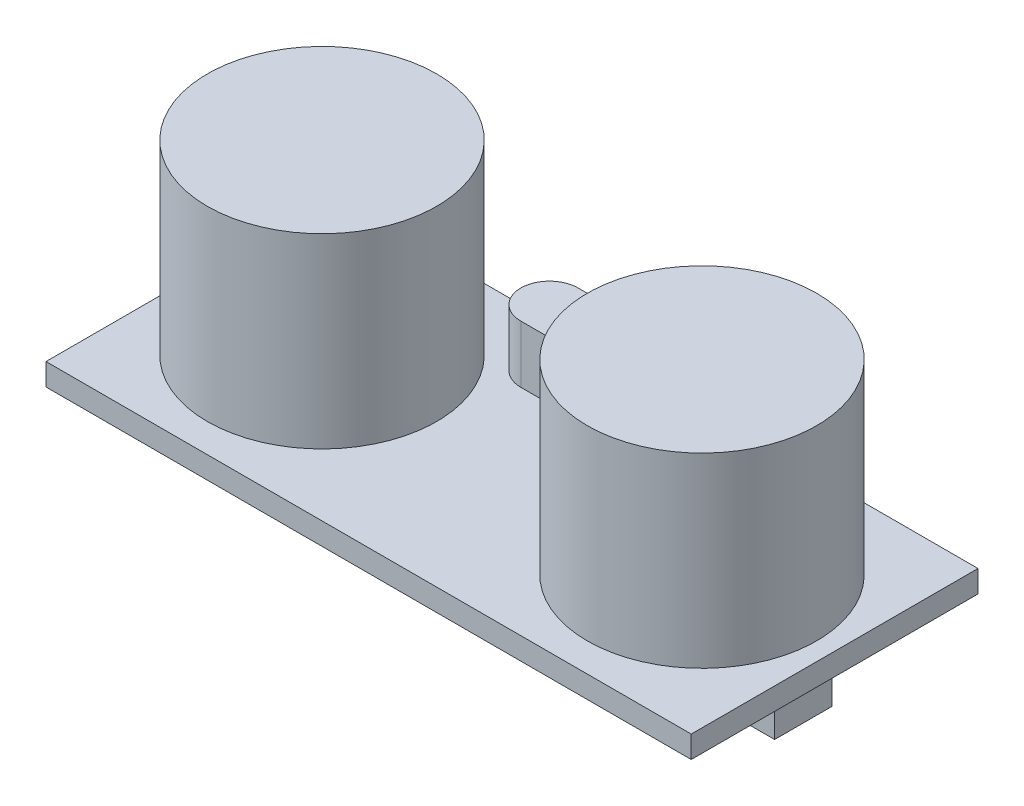
ISO-10303-21;
HEADER;
FILE_DESCRIPTION(('STEP AP214'),'2;1');
FILE_NAME('part.step','',(''),(''),'','','');
FILE_SCHEMA(('AUTOMOTIVE_DESIGN { 1 0 10303 214 1 1 1 1 }'));
ENDSEC;
DATA;
#1=APPLICATION_CONTEXT('core data for automotive mechanical design processes');
#2=APPLICATION_PROTOCOL_DEFINITION('international standard','automotive_design',2000,#1);
#3=PRODUCT_CONTEXT('',#1,'mechanical');
#4=PRODUCT('Part','Part','',(#3));
#5=PRODUCT_RELATED_PRODUCT_CATEGORY('part','',(#4));
#6=PRODUCT_DEFINITION_FORMATION('','',#4);
#7=PRODUCT_DEFINITION_CONTEXT('part definition',#1,'design');
#8=PRODUCT_DEFINITION('design','',#6,#7);
#9=PRODUCT_DEFINITION_SHAPE('','',#8);
#10=(LENGTH_UNIT() NAMED_UNIT(*) SI_UNIT(.MILLI.,.METRE.));
#11=(NAMED_UNIT(*) PLANE_ANGLE_UNIT() SI_UNIT($,.RADIAN.));
#12=(NAMED_UNIT(*) SI_UNIT($,.STERADIAN.) SOLID_ANGLE_UNIT());
#13=UNCERTAINTY_MEASURE_WITH_UNIT(LENGTH_MEASURE(1.E-05),#10,'distance_accuracy_value','');
#14=(GEOMETRIC_REPRESENTATION_CONTEXT(3) GLOBAL_UNCERTAINTY_ASSIGNED_CONTEXT((#13)) GLOBAL_UNIT_ASSIGNED_CONTEXT((#10,
#11,#12)) REPRESENTATION_CONTEXT('',''));
#15=CARTESIAN_POINT('',(0.,0.,0.));
#16=DIRECTION('',(0.,0.,1.));
#17=DIRECTION('',(1.,0.,0.));
#18=AXIS2_PLACEMENT_3D('',#15,#16,#17);
#19=CARTESIAN_POINT('',(0.,1.54,0.));
#20=DIRECTION('',(0.,-1.,0.));
#21=DIRECTION('',(0.,0.,-1.));
#22=AXIS2_PLACEMENT_3D('',#19,#20,#21);
#23=PLANE('',#22);
#24=CARTESIAN_POINT('',(13.25,1.54,0.));
#25=DIRECTION('',(0.,-1.,0.));
#26=DIRECTION('',(0.,0.,-1.));
#27=AXIS2_PLACEMENT_3D('',#24,#25,#26);
#28=CIRCLE('',#27,8.);
#29=CARTESIAN_POINT('',(13.25,1.54,-8.));
#30=VERTEX_POINT('',#29);
#31=EDGE_CURVE('E11',#30,#30,#28,.F.);
#32=ORIENTED_EDGE('',*,*,#31,.F.);
#33=EDGE_LOOP('',(#32));
#34=FACE_BOUND('',#33,.T.);
#35=DIRECTION('',(0.,0.,-1.));
#36=VECTOR('',#35,1.);
#37=CARTESIAN_POINT('',(22.5,1.54,10.));
#38=LINE('',#37,#36);
#39=CARTESIAN_POINT('',(22.5,1.54,10.));
#40=VERTEX_POINT('',#39);
#41=CARTESIAN_POINT('',(22.5,1.54,-10.));
#42=VERTEX_POINT('',#41);
#43=EDGE_CURVE('E311',#40,#42,#38,.T.);
#44=ORIENTED_EDGE('',*,*,#43,.T.);
#45=DIRECTION('',(-1.,0.,0.));
#46=VECTOR('',#45,1.);
#47=CARTESIAN_POINT('',(-22.5,1.54,-10.));
#48=LINE('',#47,#46);
#49=CARTESIAN_POINT('',(-22.5,1.54,-10.));
#50=VERTEX_POINT('',#49);
#51=EDGE_CURVE('E314',#42,#50,#48,.T.);
#52=ORIENTED_EDGE('',*,*,#51,.T.);
#53=DIRECTION('',(0.,0.,1.));
#54=VECTOR('',#53,1.);
#55=CARTESIAN_POINT('',(-22.5,1.54,10.));
#56=LINE('',#55,#54);
#57=CARTESIAN_POINT('',(-22.5,1.54,10.));
#58=VERTEX_POINT('',#57);
#59=EDGE_CURVE('E317',#50,#58,#56,.T.);
#60=ORIENTED_EDGE('',*,*,#59,.T.);
#61=DIRECTION('',(1.,0.,0.));
#62=VECTOR('',#61,1.);
#63=CARTESIAN_POINT('',(-22.5,1.54,10.));
#64=LINE('',#63,#62);
#65=EDGE_CURVE('E319',#58,#40,#64,.T.);
#66=ORIENTED_EDGE('',*,*,#65,.T.);
#67=EDGE_LOOP('',(#44,#52,#60,#66));
#68=FACE_BOUND('',#67,.T.);
#69=CARTESIAN_POINT('',(-13.25,1.54,0.));
#70=DIRECTION('',(0.,-1.,0.));
#71=DIRECTION('',(0.,0.,-1.));
#72=AXIS2_PLACEMENT_3D('',#69,#70,#71);
#73=CIRCLE('',#72,8.);
#74=CARTESIAN_POINT('',(-13.25,1.54,-8.));
#75=VERTEX_POINT('',#74);
#76=EDGE_CURVE('E41',#75,#75,#73,.F.);
#77=ORIENTED_EDGE('',*,*,#76,.F.);
#78=EDGE_LOOP('',(#77));
#79=FACE_BOUND('',#78,.T.);
#80=CARTESIAN_POINT('',(-4.38645159996524,1.54,-7.));
#81=DIRECTION('',(0.,1.,0.));
#82=DIRECTION('',(0.,0.,1.));
#83=AXIS2_PLACEMENT_3D('',#80,#81,#82);
#84=CIRCLE('',#83,2.);
#85=CARTESIAN_POINT('',(-4.38645159996524,1.54,-9.));
#86=VERTEX_POINT('',#85);
#87=CARTESIAN_POINT('',(-4.38645159996524,1.54,-5.));
#88=VERTEX_POINT('',#87);
#89=EDGE_CURVE('E263',#86,#88,#84,.T.);
#90=ORIENTED_EDGE('',*,*,#89,.F.);
#91=DIRECTION('',(-1.,0.,0.));
#92=VECTOR('',#91,1.);
#93=CARTESIAN_POINT('',(-4.38645159996524,1.54,-9.));
#94=LINE('',#93,#92);
#95=CARTESIAN_POINT('',(4.38645159996524,1.54,-9.00000000000001));
#96=VERTEX_POINT('',#95);
#97=EDGE_CURVE('E276',#96,#86,#94,.T.);
#98=ORIENTED_EDGE('',*,*,#97,.F.);
#99=CARTESIAN_POINT('',(4.38645159996524,1.54,-7.));
#100=DIRECTION('',(0.,1.,0.));
#101=DIRECTION('',(0.,0.,1.));
#102=AXIS2_PLACEMENT_3D('',#99,#100,#101);
#103=CIRCLE('',#102,2.);
#104=CARTESIAN_POINT('',(4.38645159996524,1.54,-5.));
#105=VERTEX_POINT('',#104);
#106=EDGE_CURVE('E288',#105,#96,#103,.T.);
#107=ORIENTED_EDGE('',*,*,#106,.F.);
#108=DIRECTION('',(1.,0.,0.));
#109=VECTOR('',#108,1.);
#110=CARTESIAN_POINT('',(-4.38645159996524,1.54,-5.));
#111=LINE('',#110,#109);
#112=EDGE_CURVE('E285',#88,#105,#111,.T.);
#113=ORIENTED_EDGE('',*,*,#112,.F.);
#114=EDGE_LOOP('',(#90,#98,#107,#113));
#115=FACE_BOUND('',#114,.T.);
#116=ADVANCED_FACE('F33',(#34,#68,#79,#115),#23,.F.);
#117=CARTESIAN_POINT('',(22.5,1.54,10.));
#118=DIRECTION('',(-1.,0.,0.));
#119=DIRECTION('',(0.,0.,1.));
#120=AXIS2_PLACEMENT_3D('',#117,#118,#119);
#121=PLANE('',#120);
#122=DIRECTION('',(0.,0.,-1.));
#123=VECTOR('',#122,1.);
#124=CARTESIAN_POINT('',(22.5,0.,10.));
#125=LINE('',#124,#123);
#126=CARTESIAN_POINT('',(22.5,0.,10.));
#127=VERTEX_POINT('',#126);
#128=CARTESIAN_POINT('',(22.5,0.,-10.));
#129=VERTEX_POINT('',#128);
#130=EDGE_CURVE('E310',#127,#129,#125,.T.);
#131=ORIENTED_EDGE('',*,*,#130,.T.);
#132=DIRECTION('',(0.,-1.,0.));
#133=VECTOR('',#132,1.);
#134=CARTESIAN_POINT('',(22.5,1.54,-10.));
#135=LINE('',#134,#133);
#136=EDGE_CURVE('E337',#42,#129,#135,.T.);
#137=ORIENTED_EDGE('',*,*,#136,.F.);
#138=ORIENTED_EDGE('',*,*,#43,.F.);
#139=DIRECTION('',(0.,-1.,0.));
#140=VECTOR('',#139,1.);
#141=CARTESIAN_POINT('',(22.5,1.54,10.));
#142=LINE('',#141,#140);
#143=EDGE_CURVE('E321',#40,#127,#142,.T.);
#144=ORIENTED_EDGE('',*,*,#143,.T.);
#145=EDGE_LOOP('',(#131,#137,#138,#144));
#146=FACE_BOUND('',#145,.T.);
#147=ADVANCED_FACE('F35',(#146),#121,.F.);
#148=CARTESIAN_POINT('',(-22.5,1.54,-10.));
#149=DIRECTION('',(0.,0.,1.));
#150=DIRECTION('',(1.,0.,0.));
#151=AXIS2_PLACEMENT_3D('',#148,#149,#150);
#152=PLANE('',#151);
#153=DIRECTION('',(-1.,0.,0.));
#154=VECTOR('',#153,1.);
#155=CARTESIAN_POINT('',(-22.5,0.,-10.));
#156=LINE('',#155,#154);
#157=CARTESIAN_POINT('',(-22.5,0.,-10.));
#158=VERTEX_POINT('',#157);
#159=EDGE_CURVE('E324',#129,#158,#156,.T.);
#160=ORIENTED_EDGE('',*,*,#159,.T.);
#161=DIRECTION('',(0.,-1.,0.));
#162=VECTOR('',#161,1.);
#163=CARTESIAN_POINT('',(-22.5,1.54,-10.));
#164=LINE('',#163,#162);
#165=EDGE_CURVE('E334',#50,#158,#164,.T.);
#166=ORIENTED_EDGE('',*,*,#165,.F.);
#167=ORIENTED_EDGE('',*,*,#51,.F.);
#168=ORIENTED_EDGE('',*,*,#136,.T.);
#169=EDGE_LOOP('',(#160,#166,#167,#168));
#170=FACE_BOUND('',#169,.T.);
#171=ADVANCED_FACE('F399',(#170),#152,.F.);
#172=CARTESIAN_POINT('',(-22.5,1.54,10.));
#173=DIRECTION('',(1.,0.,0.));
#174=DIRECTION('',(0.,0.,-1.));
#175=AXIS2_PLACEMENT_3D('',#172,#173,#174);
#176=PLANE('',#175);
#177=DIRECTION('',(0.,0.,1.));
#178=VECTOR('',#177,1.);
#179=CARTESIAN_POINT('',(-22.5,0.,10.));
#180=LINE('',#179,#178);
#181=CARTESIAN_POINT('',(-22.5,0.,10.));
#182=VERTEX_POINT('',#181);
#183=EDGE_CURVE('E326',#158,#182,#180,.T.);
#184=ORIENTED_EDGE('',*,*,#183,.T.);
#185=DIRECTION('',(0.,-1.,0.));
#186=VECTOR('',#185,1.);
#187=CARTESIAN_POINT('',(-22.5,1.54,10.));
#188=LINE('',#187,#186);
#189=EDGE_CURVE('E331',#58,#182,#188,.T.);
#190=ORIENTED_EDGE('',*,*,#189,.F.);
#191=ORIENTED_EDGE('',*,*,#59,.F.);
#192=ORIENTED_EDGE('',*,*,#165,.T.);
#193=EDGE_LOOP('',(#184,#190,#191,#192));
#194=FACE_BOUND('',#193,.T.);
#195=ADVANCED_FACE('F396',(#194),#176,.F.);
#196=CARTESIAN_POINT('',(-22.5,1.54,10.));
#197=DIRECTION('',(0.,0.,-1.));
#198=DIRECTION('',(-1.,0.,0.));
#199=AXIS2_PLACEMENT_3D('',#196,#197,#198);
#200=PLANE('',#199);
#201=DIRECTION('',(1.,0.,0.));
#202=VECTOR('',#201,1.);
#203=CARTESIAN_POINT('',(-22.5,0.,10.));
#204=LINE('',#203,#202);
#205=EDGE_CURVE('E315',#182,#127,#204,.T.);
#206=ORIENTED_EDGE('',*,*,#205,.T.);
#207=ORIENTED_EDGE('',*,*,#143,.F.);
#208=ORIENTED_EDGE('',*,*,#65,.F.);
#209=ORIENTED_EDGE('',*,*,#189,.T.);
#210=EDGE_LOOP('',(#206,#207,#208,#209));
#211=FACE_BOUND('',#210,.T.);
#212=ADVANCED_FACE('F393',(#211),#200,.F.);
#213=CARTESIAN_POINT('',(0.,0.,0.));
#214=DIRECTION('',(0.,-1.,0.));
#215=DIRECTION('',(0.,0.,-1.));
#216=AXIS2_PLACEMENT_3D('',#213,#214,#215);
#217=PLANE('',#216);
#218=DIRECTION('',(0.,0.,-1.));
#219=VECTOR('',#218,1.);
#220=CARTESIAN_POINT('',(-15.9,0.,6.));
#221=LINE('',#220,#219);
#222=CARTESIAN_POINT('',(-15.9,0.,6.));
#223=VERTEX_POINT('',#222);
#224=CARTESIAN_POINT('',(-15.9,0.,-2.9));
#225=VERTEX_POINT('',#224);
#226=EDGE_CURVE('E199',#223,#225,#221,.T.);
#227=ORIENTED_EDGE('',*,*,#226,.T.);
#228=DIRECTION('',(-1.,0.,0.));
#229=VECTOR('',#228,1.);
#230=CARTESIAN_POINT('',(-19.9,0.,-2.9));
#231=LINE('',#230,#229);
#232=CARTESIAN_POINT('',(-19.9,0.,-2.9));
#233=VERTEX_POINT('',#232);
#234=EDGE_CURVE('E175',#225,#233,#231,.T.);
#235=ORIENTED_EDGE('',*,*,#234,.T.);
#236=DIRECTION('',(0.,0.,1.));
#237=VECTOR('',#236,1.);
#238=CARTESIAN_POINT('',(-19.9,0.,6.));
#239=LINE('',#238,#237);
#240=CARTESIAN_POINT('',(-19.9,0.,6.));
#241=VERTEX_POINT('',#240);
#242=EDGE_CURVE('E53',#233,#241,#239,.T.);
#243=ORIENTED_EDGE('',*,*,#242,.T.);
#244=DIRECTION('',(1.,0.,0.));
#245=VECTOR('',#244,1.);
#246=CARTESIAN_POINT('',(-19.9,0.,6.));
#247=LINE('',#246,#245);
#248=EDGE_CURVE('E48',#241,#223,#247,.T.);
#249=ORIENTED_EDGE('',*,*,#248,.T.);
#250=EDGE_LOOP('',(#227,#235,#243,#249));
#251=FACE_BOUND('',#250,.T.);
#252=DIRECTION('',(0.,0.,-1.));
#253=VECTOR('',#252,1.);
#254=CARTESIAN_POINT('',(20.7,0.,-1.61583617625605));
#255=LINE('',#254,#253);
#256=CARTESIAN_POINT('',(20.7,0.,2.38416382374395));
#257=VERTEX_POINT('',#256);
#258=CARTESIAN_POINT('',(20.7,0.,-1.61583617625605));
#259=VERTEX_POINT('',#258);
#260=EDGE_CURVE('E204',#257,#259,#255,.T.);
#261=ORIENTED_EDGE('',*,*,#260,.T.);
#262=DIRECTION('',(-1.,0.,0.));
#263=VECTOR('',#262,1.);
#264=CARTESIAN_POINT('',(11.8,0.,-1.61583617625605));
#265=LINE('',#264,#263);
#266=CARTESIAN_POINT('',(11.8,0.,-1.61583617625605));
#267=VERTEX_POINT('',#266);
#268=EDGE_CURVE('E223',#259,#267,#265,.T.);
#269=ORIENTED_EDGE('',*,*,#268,.T.);
#270=DIRECTION('',(0.,0.,1.));
#271=VECTOR('',#270,1.);
#272=CARTESIAN_POINT('',(11.8,0.,-1.61583617625605));
#273=LINE('',#272,#271);
#274=CARTESIAN_POINT('',(11.8,0.,2.38416382374395));
#275=VERTEX_POINT('',#274);
#276=EDGE_CURVE('E225',#267,#275,#273,.T.);
#277=ORIENTED_EDGE('',*,*,#276,.T.);
#278=DIRECTION('',(1.,0.,0.));
#279=VECTOR('',#278,1.);
#280=CARTESIAN_POINT('',(11.8,0.,2.38416382374395));
#281=LINE('',#280,#279);
#282=EDGE_CURVE('E212',#275,#257,#281,.T.);
#283=ORIENTED_EDGE('',*,*,#282,.T.);
#284=EDGE_LOOP('',(#261,#269,#277,#283));
#285=FACE_BOUND('',#284,.T.);
#286=DIRECTION('',(0.,0.,-1.));
#287=VECTOR('',#286,1.);
#288=CARTESIAN_POINT('',(4.45,0.,-2.));
#289=LINE('',#288,#287);
#290=CARTESIAN_POINT('',(4.45,0.,2.));
#291=VERTEX_POINT('',#290);
#292=CARTESIAN_POINT('',(4.45,0.,-2.));
#293=VERTEX_POINT('',#292);
#294=EDGE_CURVE('E231',#291,#293,#289,.T.);
#295=ORIENTED_EDGE('',*,*,#294,.T.);
#296=DIRECTION('',(-1.,0.,0.));
#297=VECTOR('',#296,1.);
#298=CARTESIAN_POINT('',(-4.45,0.,-2.));
#299=LINE('',#298,#297);
#300=CARTESIAN_POINT('',(-4.45,0.,-2.));
#301=VERTEX_POINT('',#300);
#302=EDGE_CURVE('E255',#293,#301,#299,.T.);
#303=ORIENTED_EDGE('',*,*,#302,.T.);
#304=DIRECTION('',(0.,0.,1.));
#305=VECTOR('',#304,1.);
#306=CARTESIAN_POINT('',(-4.45,0.,-2.));
#307=LINE('',#306,#305);
#308=CARTESIAN_POINT('',(-4.45,0.,2.));
#309=VERTEX_POINT('',#308);
#310=EDGE_CURVE('E257',#301,#309,#307,.T.);
#311=ORIENTED_EDGE('',*,*,#310,.T.);
#312=DIRECTION('',(1.,0.,0.));
#313=VECTOR('',#312,1.);
#314=CARTESIAN_POINT('',(-4.45,0.,2.));
#315=LINE('',#314,#313);
#316=EDGE_CURVE('E244',#309,#291,#315,.T.);
#317=ORIENTED_EDGE('',*,*,#316,.T.);
#318=EDGE_LOOP('',(#295,#303,#311,#317));
#319=FACE_BOUND('',#318,.T.);
#320=ORIENTED_EDGE('',*,*,#130,.F.);
#321=ORIENTED_EDGE('',*,*,#205,.F.);
#322=ORIENTED_EDGE('',*,*,#183,.F.);
#323=ORIENTED_EDGE('',*,*,#159,.F.);
#324=EDGE_LOOP('',(#320,#321,#322,#323));
#325=FACE_BOUND('',#324,.T.);
#326=ADVANCED_FACE('F388',(#251,#285,#319,#325),#217,.T.);
#327=CARTESIAN_POINT('',(-13.25,14.54,0.));
#328=DIRECTION('',(0.,-1.,0.));
#329=DIRECTION('',(0.,0.,-1.));
#330=AXIS2_PLACEMENT_3D('',#327,#328,#329);
#331=CYLINDRICAL_SURFACE('',#330,8.);
#332=CARTESIAN_POINT('',(-13.25,14.54,0.));
#333=DIRECTION('',(0.,1.,0.));
#334=DIRECTION('',(0.,0.,1.));
#335=AXIS2_PLACEMENT_3D('',#332,#333,#334);
#336=CIRCLE('',#335,8.);
#337=CARTESIAN_POINT('',(-13.25,14.54,-8.));
#338=VERTEX_POINT('',#337);
#339=EDGE_CURVE('E307',#338,#338,#336,.T.);
#340=CARTESIAN_POINT('',(-13.25,14.54,-8.));
#341=CARTESIAN_POINT('',(-13.25,14.4045833333333,-8.));
#342=CARTESIAN_POINT('',(-13.25,14.2691666666667,-8.));
#343=CARTESIAN_POINT('',(-13.25,13.9983333333333,-8.));
#344=CARTESIAN_POINT('',(-13.25,13.8629166666667,-8.));
#345=CARTESIAN_POINT('',(-13.25,13.5920833333333,-8.));
#346=CARTESIAN_POINT('',(-13.25,13.4566666666667,-8.));
#347=CARTESIAN_POINT('',(-13.25,13.1858333333333,-8.));
#348=CARTESIAN_POINT('',(-13.25,13.0504166666667,-8.));
#349=CARTESIAN_POINT('',(-13.25,12.7795833333333,-8.));
#350=CARTESIAN_POINT('',(-13.25,12.6441666666667,-8.));
#351=CARTESIAN_POINT('',(-13.25,12.3733333333333,-8.));
#352=CARTESIAN_POINT('',(-13.25,12.2379166666667,-8.));
#353=CARTESIAN_POINT('',(-13.25,11.9670833333333,-8.));
#354=CARTESIAN_POINT('',(-13.25,11.8316666666667,-8.));
#355=CARTESIAN_POINT('',(-13.25,11.5608333333333,-8.));
#356=CARTESIAN_POINT('',(-13.25,11.4254166666667,-8.));
#357=CARTESIAN_POINT('',(-13.25,11.1545833333333,-8.));
#358=CARTESIAN_POINT('',(-13.25,11.0191666666667,-8.));
#359=CARTESIAN_POINT('',(-13.25,10.7483333333333,-8.));
#360=CARTESIAN_POINT('',(-13.25,10.6129166666667,-8.));
#361=CARTESIAN_POINT('',(-13.25,10.3420833333333,-8.));
#362=CARTESIAN_POINT('',(-13.25,10.2066666666667,-8.));
#363=CARTESIAN_POINT('',(-13.25,9.93583333333333,-8.));
#364=CARTESIAN_POINT('',(-13.25,9.80041666666667,-8.));
#365=CARTESIAN_POINT('',(-13.25,9.52958333333333,-8.));
#366=CARTESIAN_POINT('',(-13.25,9.39416666666667,-8.));
#367=CARTESIAN_POINT('',(-13.25,9.12333333333333,-8.));
#368=CARTESIAN_POINT('',(-13.25,8.98791666666667,-8.));
#369=CARTESIAN_POINT('',(-13.25,8.71708333333333,-8.));
#370=CARTESIAN_POINT('',(-13.25,8.58166666666667,-8.));
#371=CARTESIAN_POINT('',(-13.25,8.31083333333333,-8.));
#372=CARTESIAN_POINT('',(-13.25,8.17541666666667,-8.));
#373=CARTESIAN_POINT('',(-13.25,7.90458333333333,-8.));
#374=CARTESIAN_POINT('',(-13.25,7.76916666666666,-8.));
#375=CARTESIAN_POINT('',(-13.25,7.49833333333333,-8.));
#376=CARTESIAN_POINT('',(-13.25,7.36291666666667,-8.));
#377=CARTESIAN_POINT('',(-13.25,7.09208333333333,-8.));
#378=CARTESIAN_POINT('',(-13.25,6.95666666666667,-8.));
#379=CARTESIAN_POINT('',(-13.25,6.68583333333333,-8.));
#380=CARTESIAN_POINT('',(-13.25,6.55041666666667,-8.));
#381=CARTESIAN_POINT('',(-13.25,6.27958333333333,-8.));
#382=CARTESIAN_POINT('',(-13.25,6.14416666666667,-8.));
#383=CARTESIAN_POINT('',(-13.25,5.87333333333333,-8.));
#384=CARTESIAN_POINT('',(-13.25,5.73791666666667,-8.));
#385=CARTESIAN_POINT('',(-13.25,5.46708333333333,-8.));
#386=CARTESIAN_POINT('',(-13.25,5.33166666666667,-8.));
#387=CARTESIAN_POINT('',(-13.25,5.06083333333333,-8.));
#388=CARTESIAN_POINT('',(-13.25,4.92541666666667,-8.));
#389=CARTESIAN_POINT('',(-13.25,4.65458333333333,-8.));
#390=CARTESIAN_POINT('',(-13.25,4.51916666666667,-8.));
#391=CARTESIAN_POINT('',(-13.25,4.24833333333333,-8.));
#392=CARTESIAN_POINT('',(-13.25,4.11291666666667,-8.));
#393=CARTESIAN_POINT('',(-13.25,3.84208333333333,-8.));
#394=CARTESIAN_POINT('',(-13.25,3.70666666666667,-8.));
#395=CARTESIAN_POINT('',(-13.25,3.43583333333333,-8.));
#396=CARTESIAN_POINT('',(-13.25,3.30041666666667,-8.));
#397=CARTESIAN_POINT('',(-13.25,3.02958333333333,-8.));
#398=CARTESIAN_POINT('',(-13.25,2.89416666666667,-8.));
#399=CARTESIAN_POINT('',(-13.25,2.62333333333333,-8.));
#400=CARTESIAN_POINT('',(-13.25,2.48791666666667,-8.));
#401=CARTESIAN_POINT('',(-13.25,2.21708333333333,-8.));
#402=CARTESIAN_POINT('',(-13.25,2.08166666666667,-8.));
#403=CARTESIAN_POINT('',(-13.25,1.81083333333333,-8.));
#404=CARTESIAN_POINT('',(-13.25,1.67541666666667,-8.));
#405=CARTESIAN_POINT('',(-13.25,1.54,-8.));
#406=B_SPLINE_CURVE_WITH_KNOTS('',3,(#340,#341,#342,#343,#344,#345,#346,#347,#348,#349,#350,
#351,#352,#353,#354,#355,#356,#357,#358,#359,#360,#361,#362,#363,#364,#365,#366,#367,#368,#369,
#370,#371,#372,#373,#374,#375,#376,#377,#378,#379,#380,#381,#382,#383,#384,#385,#386,#387,#388,
#389,#390,#391,#392,#393,#394,#395,#396,#397,#398,#399,#400,#401,#402,#403,#404,#405),
.UNSPECIFIED.,.F.,.F.,(4,2,2,2,2,2,2,2,2,2,2,2,2,2,2,2,2,2,2,2,2,2,2,2,2,2,2,2,2,2,2,2,4),(0.,
0.40625,0.812500000000001,1.21875,1.625,2.03125,2.4375,2.84375,3.25,3.65625,4.0625,4.46875,
4.875,5.28125,5.6875,6.09375,6.5,6.90625,7.3125,7.71875,8.125,8.53125,8.9375,9.34375,9.75,
10.15625,10.5625,10.96875,11.375,11.78125,12.1875,12.59375,13.),.UNSPECIFIED.);
#407=EDGE_CURVE('BSEAM342',#338,#75,#406,.T.);
#408=ORIENTED_EDGE('',*,*,#339,.F.);
#409=ORIENTED_EDGE('',*,*,#76,.T.);
#410=ORIENTED_EDGE('',*,*,#407,.T.);
#411=ORIENTED_EDGE('',*,*,#407,.F.);
#412=EDGE_LOOP('',(#408,#410,#409,#411));
#413=FACE_BOUND('',#412,.T.);
#414=ADVANCED_FACE('F342',(#413),#331,.T.);
#415=CARTESIAN_POINT('',(-13.25,14.54,0.));
#416=DIRECTION('',(0.,1.,0.));
#417=DIRECTION('',(0.,0.,1.));
#418=AXIS2_PLACEMENT_3D('',#415,#416,#417);
#419=PLANE('',#418);
#420=ORIENTED_EDGE('',*,*,#339,.T.);
#421=EDGE_LOOP('',(#420));
#422=FACE_BOUND('',#421,.T.);
#423=ADVANCED_FACE('F382',(#422),#419,.T.);
#424=CARTESIAN_POINT('',(13.25,14.54,0.));
#425=DIRECTION('',(0.,-1.,0.));
#426=DIRECTION('',(0.,0.,-1.));
#427=AXIS2_PLACEMENT_3D('',#424,#425,#426);
#428=CYLINDRICAL_SURFACE('',#427,8.);
#429=CARTESIAN_POINT('',(13.25,14.54,0.));
#430=DIRECTION('',(0.,1.,0.));
#431=DIRECTION('',(0.,0.,1.));
#432=AXIS2_PLACEMENT_3D('',#429,#430,#431);
#433=CIRCLE('',#432,8.);
#434=CARTESIAN_POINT('',(13.25,14.54,-8.));
#435=VERTEX_POINT('',#434);
#436=EDGE_CURVE('E304',#435,#435,#433,.T.);
#437=CARTESIAN_POINT('',(13.25,14.54,-8.));
#438=CARTESIAN_POINT('',(13.25,14.4045833333333,-8.));
#439=CARTESIAN_POINT('',(13.25,14.2691666666667,-8.));
#440=CARTESIAN_POINT('',(13.25,13.9983333333333,-8.));
#441=CARTESIAN_POINT('',(13.25,13.8629166666667,-8.));
#442=CARTESIAN_POINT('',(13.25,13.5920833333333,-8.));
#443=CARTESIAN_POINT('',(13.25,13.4566666666667,-8.));
#444=CARTESIAN_POINT('',(13.25,13.1858333333333,-8.));
#445=CARTESIAN_POINT('',(13.25,13.0504166666667,-8.));
#446=CARTESIAN_POINT('',(13.25,12.7795833333333,-8.));
#447=CARTESIAN_POINT('',(13.25,12.6441666666667,-8.));
#448=CARTESIAN_POINT('',(13.25,12.3733333333333,-8.));
#449=CARTESIAN_POINT('',(13.25,12.2379166666667,-8.));
#450=CARTESIAN_POINT('',(13.25,11.9670833333333,-8.));
#451=CARTESIAN_POINT('',(13.25,11.8316666666667,-8.));
#452=CARTESIAN_POINT('',(13.25,11.5608333333333,-8.));
#453=CARTESIAN_POINT('',(13.25,11.4254166666667,-8.));
#454=CARTESIAN_POINT('',(13.25,11.1545833333333,-8.));
#455=CARTESIAN_POINT('',(13.25,11.0191666666667,-8.));
#456=CARTESIAN_POINT('',(13.25,10.7483333333333,-8.));
#457=CARTESIAN_POINT('',(13.25,10.6129166666667,-8.));
#458=CARTESIAN_POINT('',(13.25,10.3420833333333,-8.));
#459=CARTESIAN_POINT('',(13.25,10.2066666666667,-8.));
#460=CARTESIAN_POINT('',(13.25,9.93583333333333,-8.));
#461=CARTESIAN_POINT('',(13.25,9.80041666666667,-8.));
#462=CARTESIAN_POINT('',(13.25,9.52958333333333,-8.));
#463=CARTESIAN_POINT('',(13.25,9.39416666666667,-8.));
#464=CARTESIAN_POINT('',(13.25,9.12333333333333,-8.));
#465=CARTESIAN_POINT('',(13.25,8.98791666666667,-8.));
#466=CARTESIAN_POINT('',(13.25,8.71708333333333,-8.));
#467=CARTESIAN_POINT('',(13.25,8.58166666666667,-8.));
#468=CARTESIAN_POINT('',(13.25,8.31083333333333,-8.));
#469=CARTESIAN_POINT('',(13.25,8.17541666666667,-8.));
#470=CARTESIAN_POINT('',(13.25,7.90458333333333,-8.));
#471=CARTESIAN_POINT('',(13.25,7.76916666666666,-8.));
#472=CARTESIAN_POINT('',(13.25,7.49833333333333,-8.));
#473=CARTESIAN_POINT('',(13.25,7.36291666666667,-8.));
#474=CARTESIAN_POINT('',(13.25,7.09208333333333,-8.));
#475=CARTESIAN_POINT('',(13.25,6.95666666666667,-8.));
#476=CARTESIAN_POINT('',(13.25,6.68583333333333,-8.));
#477=CARTESIAN_POINT('',(13.25,6.55041666666667,-8.));
#478=CARTESIAN_POINT('',(13.25,6.27958333333333,-8.));
#479=CARTESIAN_POINT('',(13.25,6.14416666666667,-8.));
#480=CARTESIAN_POINT('',(13.25,5.87333333333333,-8.));
#481=CARTESIAN_POINT('',(13.25,5.73791666666667,-8.));
#482=CARTESIAN_POINT('',(13.25,5.46708333333333,-8.));
#483=CARTESIAN_POINT('',(13.25,5.33166666666667,-8.));
#484=CARTESIAN_POINT('',(13.25,5.06083333333333,-8.));
#485=CARTESIAN_POINT('',(13.25,4.92541666666667,-8.));
#486=CARTESIAN_POINT('',(13.25,4.65458333333333,-8.));
#487=CARTESIAN_POINT('',(13.25,4.51916666666667,-8.));
#488=CARTESIAN_POINT('',(13.25,4.24833333333333,-8.));
#489=CARTESIAN_POINT('',(13.25,4.11291666666667,-8.));
#490=CARTESIAN_POINT('',(13.25,3.84208333333333,-8.));
#491=CARTESIAN_POINT('',(13.25,3.70666666666667,-8.));
#492=CARTESIAN_POINT('',(13.25,3.43583333333333,-8.));
#493=CARTESIAN_POINT('',(13.25,3.30041666666667,-8.));
#494=CARTESIAN_POINT('',(13.25,3.02958333333333,-8.));
#495=CARTESIAN_POINT('',(13.25,2.89416666666667,-8.));
#496=CARTESIAN_POINT('',(13.25,2.62333333333333,-8.));
#497=CARTESIAN_POINT('',(13.25,2.48791666666667,-8.));
#498=CARTESIAN_POINT('',(13.25,2.21708333333333,-8.));
#499=CARTESIAN_POINT('',(13.25,2.08166666666667,-8.));
#500=CARTESIAN_POINT('',(13.25,1.81083333333333,-8.));
#501=CARTESIAN_POINT('',(13.25,1.67541666666667,-8.));
#502=CARTESIAN_POINT('',(13.25,1.54,-8.));
#503=B_SPLINE_CURVE_WITH_KNOTS('',3,(#437,#438,#439,#440,#441,#442,#443,#444,#445,#446,#447,
#448,#449,#450,#451,#452,#453,#454,#455,#456,#457,#458,#459,#460,#461,#462,#463,#464,#465,#466,
#467,#468,#469,#470,#471,#472,#473,#474,#475,#476,#477,#478,#479,#480,#481,#482,#483,#484,#485,
#486,#487,#488,#489,#490,#491,#492,#493,#494,#495,#496,#497,#498,#499,#500,#501,#502),
.UNSPECIFIED.,.F.,.F.,(4,2,2,2,2,2,2,2,2,2,2,2,2,2,2,2,2,2,2,2,2,2,2,2,2,2,2,2,2,2,2,2,4),(0.,
0.40625,0.812500000000001,1.21875,1.625,2.03125,2.4375,2.84375,3.25,3.65625,4.0625,4.46875,
4.875,5.28125,5.6875,6.09375,6.5,6.90625,7.3125,7.71875,8.125,8.53125,8.9375,9.34375,9.75,
10.15625,10.5625,10.96875,11.375,11.78125,12.1875,12.59375,13.),.UNSPECIFIED.);
#504=EDGE_CURVE('BSEAM378',#435,#30,#503,.T.);
#505=ORIENTED_EDGE('',*,*,#436,.F.);
#506=ORIENTED_EDGE('',*,*,#31,.T.);
#507=ORIENTED_EDGE('',*,*,#504,.T.);
#508=ORIENTED_EDGE('',*,*,#504,.F.);
#509=EDGE_LOOP('',(#505,#507,#506,#508));
#510=FACE_BOUND('',#509,.T.);
#511=ADVANCED_FACE('F378',(#510),#428,.T.);
#512=CARTESIAN_POINT('',(13.25,14.54,0.));
#513=DIRECTION('',(0.,1.,0.));
#514=DIRECTION('',(0.,0.,1.));
#515=AXIS2_PLACEMENT_3D('',#512,#513,#514);
#516=PLANE('',#515);
#517=ORIENTED_EDGE('',*,*,#436,.T.);
#518=EDGE_LOOP('',(#517));
#519=FACE_BOUND('',#518,.T.);
#520=ADVANCED_FACE('F372',(#519),#516,.T.);
#521=CARTESIAN_POINT('',(-4.38645159996524,5.54,-7.));
#522=DIRECTION('',(0.,-1.,0.));
#523=DIRECTION('',(0.,0.,-1.));
#524=AXIS2_PLACEMENT_3D('',#521,#522,#523);
#525=CYLINDRICAL_SURFACE('',#524,2.);
#526=ORIENTED_EDGE('',*,*,#89,.T.);
#527=DIRECTION('',(0.,-1.,0.));
#528=VECTOR('',#527,1.);
#529=CARTESIAN_POINT('',(-4.38645159996524,5.54,-5.));
#530=LINE('',#529,#528);
#531=CARTESIAN_POINT('',(-4.38645159996524,5.54,-5.));
#532=VERTEX_POINT('',#531);
#533=EDGE_CURVE('E301',#532,#88,#530,.T.);
#534=ORIENTED_EDGE('',*,*,#533,.F.);
#535=CARTESIAN_POINT('',(-4.38645159996524,5.54,-7.));
#536=DIRECTION('',(0.,1.,0.));
#537=DIRECTION('',(0.,0.,1.));
#538=AXIS2_PLACEMENT_3D('',#535,#536,#537);
#539=CIRCLE('',#538,2.);
#540=CARTESIAN_POINT('',(-4.38645159996524,5.54,-9.));
#541=VERTEX_POINT('',#540);
#542=EDGE_CURVE('E272',#541,#532,#539,.T.);
#543=ORIENTED_EDGE('',*,*,#542,.F.);
#544=DIRECTION('',(0.,-1.,0.));
#545=VECTOR('',#544,1.);
#546=CARTESIAN_POINT('',(-4.38645159996524,5.54,-9.));
#547=LINE('',#546,#545);
#548=EDGE_CURVE('E282',#541,#86,#547,.T.);
#549=ORIENTED_EDGE('',*,*,#548,.T.);
#550=EDGE_LOOP('',(#526,#534,#543,#549));
#551=FACE_BOUND('',#550,.T.);
#552=ADVANCED_FACE('F356',(#551),#525,.T.);
#553=CARTESIAN_POINT('',(-4.38645159996524,5.54,-5.));
#554=DIRECTION('',(0.,0.,-1.));
#555=DIRECTION('',(-1.,0.,0.));
#556=AXIS2_PLACEMENT_3D('',#553,#554,#555);
#557=PLANE('',#556);
#558=ORIENTED_EDGE('',*,*,#112,.T.);
#559=DIRECTION('',(0.,-1.,0.));
#560=VECTOR('',#559,1.);
#561=CARTESIAN_POINT('',(4.38645159996524,5.54,-5.));
#562=LINE('',#561,#560);
#563=CARTESIAN_POINT('',(4.38645159996524,5.54,-5.));
#564=VERTEX_POINT('',#563);
#565=EDGE_CURVE('E298',#564,#105,#562,.T.);
#566=ORIENTED_EDGE('',*,*,#565,.F.);
#567=DIRECTION('',(1.,0.,0.));
#568=VECTOR('',#567,1.);
#569=CARTESIAN_POINT('',(-4.38645159996524,5.54,-5.));
#570=LINE('',#569,#568);
#571=EDGE_CURVE('E275',#532,#564,#570,.T.);
#572=ORIENTED_EDGE('',*,*,#571,.F.);
#573=ORIENTED_EDGE('',*,*,#533,.T.);
#574=EDGE_LOOP('',(#558,#566,#572,#573));
#575=FACE_BOUND('',#574,.T.);
#576=ADVANCED_FACE('F364',(#575),#557,.F.);
#577=CARTESIAN_POINT('',(4.38645159996524,5.54,-7.));
#578=DIRECTION('',(0.,-1.,0.));
#579=DIRECTION('',(0.,0.,-1.));
#580=AXIS2_PLACEMENT_3D('',#577,#578,#579);
#581=CYLINDRICAL_SURFACE('',#580,2.);
#582=ORIENTED_EDGE('',*,*,#106,.T.);
#583=DIRECTION('',(0.,-1.,0.));
#584=VECTOR('',#583,1.);
#585=CARTESIAN_POINT('',(4.38645159996524,5.54,-9.));
#586=LINE('',#585,#584);
#587=CARTESIAN_POINT('',(4.38645159996524,5.54,-9.));
#588=VERTEX_POINT('',#587);
#589=EDGE_CURVE('E295',#588,#96,#586,.T.);
#590=ORIENTED_EDGE('',*,*,#589,.F.);
#591=CARTESIAN_POINT('',(4.38645159996524,5.54,-7.));
#592=DIRECTION('',(0.,1.,0.));
#593=DIRECTION('',(0.,0.,1.));
#594=AXIS2_PLACEMENT_3D('',#591,#592,#593);
#595=CIRCLE('',#594,2.);
#596=EDGE_CURVE('E278',#564,#588,#595,.T.);
#597=ORIENTED_EDGE('',*,*,#596,.F.);
#598=ORIENTED_EDGE('',*,*,#565,.T.);
#599=EDGE_LOOP('',(#582,#590,#597,#598));
#600=FACE_BOUND('',#599,.T.);
#601=ADVANCED_FACE('F362',(#600),#581,.T.);
#602=CARTESIAN_POINT('',(-4.38645159996524,5.54,-9.));
#603=DIRECTION('',(0.,0.,1.));
#604=DIRECTION('',(1.,0.,0.));
#605=AXIS2_PLACEMENT_3D('',#602,#603,#604);
#606=PLANE('',#605);
#607=ORIENTED_EDGE('',*,*,#97,.T.);
#608=ORIENTED_EDGE('',*,*,#548,.F.);
#609=DIRECTION('',(-1.,0.,0.));
#610=VECTOR('',#609,1.);
#611=CARTESIAN_POINT('',(-4.38645159996524,5.54,-9.));
#612=LINE('',#611,#610);
#613=EDGE_CURVE('E280',#588,#541,#612,.T.);
#614=ORIENTED_EDGE('',*,*,#613,.F.);
#615=ORIENTED_EDGE('',*,*,#589,.T.);
#616=EDGE_LOOP('',(#607,#608,#614,#615));
#617=FACE_BOUND('',#616,.T.);
#618=ADVANCED_FACE('F352',(#617),#606,.F.);
#619=CARTESIAN_POINT('',(-4.38645159996524,5.54,-7.));
#620=DIRECTION('',(0.,1.,0.));
#621=DIRECTION('',(0.,0.,1.));
#622=AXIS2_PLACEMENT_3D('',#619,#620,#621);
#623=PLANE('',#622);
#624=ORIENTED_EDGE('',*,*,#542,.T.);
#625=ORIENTED_EDGE('',*,*,#571,.T.);
#626=ORIENTED_EDGE('',*,*,#596,.T.);
#627=ORIENTED_EDGE('',*,*,#613,.T.);
#628=EDGE_LOOP('',(#624,#625,#626,#627));
#629=FACE_BOUND('',#628,.T.);
#630=ADVANCED_FACE('F358',(#629),#623,.T.);
#631=CARTESIAN_POINT('',(4.45,-3.5,-2.));
#632=DIRECTION('',(1.,0.,0.));
#633=DIRECTION('',(0.,0.,-1.));
#634=AXIS2_PLACEMENT_3D('',#631,#632,#633);
#635=PLANE('',#634);
#636=ORIENTED_EDGE('',*,*,#294,.F.);
#637=DIRECTION('',(0.,1.,0.));
#638=VECTOR('',#637,1.);
#639=CARTESIAN_POINT('',(4.45,-3.5,2.));
#640=LINE('',#639,#638);
#641=CARTESIAN_POINT('',(4.45,-3.5,2.));
#642=VERTEX_POINT('',#641);
#643=EDGE_CURVE('E260',#642,#291,#640,.T.);
#644=ORIENTED_EDGE('',*,*,#643,.F.);
#645=DIRECTION('',(0.,0.,-1.));
#646=VECTOR('',#645,1.);
#647=CARTESIAN_POINT('',(4.45,-3.5,-2.));
#648=LINE('',#647,#646);
#649=CARTESIAN_POINT('',(4.45,-3.5,-2.));
#650=VERTEX_POINT('',#649);
#651=EDGE_CURVE('E240',#642,#650,#648,.T.);
#652=ORIENTED_EDGE('',*,*,#651,.T.);
#653=DIRECTION('',(0.,1.,0.));
#654=VECTOR('',#653,1.);
#655=CARTESIAN_POINT('',(4.45,-3.5,-2.));
#656=LINE('',#655,#654);
#657=EDGE_CURVE('E253',#650,#293,#656,.T.);
#658=ORIENTED_EDGE('',*,*,#657,.T.);
#659=EDGE_LOOP('',(#636,#644,#652,#658));
#660=FACE_BOUND('',#659,.T.);
#661=ADVANCED_FACE('F461',(#660),#635,.T.);
#662=CARTESIAN_POINT('',(-4.45,-3.5,2.));
#663=DIRECTION('',(0.,0.,1.));
#664=DIRECTION('',(1.,0.,0.));
#665=AXIS2_PLACEMENT_3D('',#662,#663,#664);
#666=PLANE('',#665);
#667=ORIENTED_EDGE('',*,*,#316,.F.);
#668=DIRECTION('',(0.,1.,0.));
#669=VECTOR('',#668,1.);
#670=CARTESIAN_POINT('',(-4.45,-3.5,2.));
#671=LINE('',#670,#669);
#672=CARTESIAN_POINT('',(-4.45,-3.5,2.));
#673=VERTEX_POINT('',#672);
#674=EDGE_CURVE('E264',#673,#309,#671,.T.);
#675=ORIENTED_EDGE('',*,*,#674,.F.);
#676=DIRECTION('',(1.,0.,0.));
#677=VECTOR('',#676,1.);
#678=CARTESIAN_POINT('',(-4.45,-3.5,2.));
#679=LINE('',#678,#677);
#680=EDGE_CURVE('E250',#673,#642,#679,.T.);
#681=ORIENTED_EDGE('',*,*,#680,.T.);
#682=ORIENTED_EDGE('',*,*,#643,.T.);
#683=EDGE_LOOP('',(#667,#675,#681,#682));
#684=FACE_BOUND('',#683,.T.);
#685=ADVANCED_FACE('F478',(#684),#666,.T.);
#686=CARTESIAN_POINT('',(-4.45,-3.5,-2.));
#687=DIRECTION('',(-1.,0.,0.));
#688=DIRECTION('',(0.,0.,1.));
#689=AXIS2_PLACEMENT_3D('',#686,#687,#688);
#690=PLANE('',#689);
#691=ORIENTED_EDGE('',*,*,#310,.F.);
#692=DIRECTION('',(0.,1.,0.));
#693=VECTOR('',#692,1.);
#694=CARTESIAN_POINT('',(-4.45,-3.5,-2.));
#695=LINE('',#694,#693);
#696=CARTESIAN_POINT('',(-4.45,-3.5,-2.));
#697=VERTEX_POINT('',#696);
#698=EDGE_CURVE('E267',#697,#301,#695,.T.);
#699=ORIENTED_EDGE('',*,*,#698,.F.);
#700=DIRECTION('',(0.,0.,1.));
#701=VECTOR('',#700,1.);
#702=CARTESIAN_POINT('',(-4.45,-3.5,-2.));
#703=LINE('',#702,#701);
#704=EDGE_CURVE('E247',#697,#673,#703,.T.);
#705=ORIENTED_EDGE('',*,*,#704,.T.);
#706=ORIENTED_EDGE('',*,*,#674,.T.);
#707=EDGE_LOOP('',(#691,#699,#705,#706));
#708=FACE_BOUND('',#707,.T.);
#709=ADVANCED_FACE('F488',(#708),#690,.T.);
#710=CARTESIAN_POINT('',(-4.45,-3.5,-2.));
#711=DIRECTION('',(0.,0.,-1.));
#712=DIRECTION('',(-1.,0.,0.));
#713=AXIS2_PLACEMENT_3D('',#710,#711,#712);
#714=PLANE('',#713);
#715=ORIENTED_EDGE('',*,*,#302,.F.);
#716=ORIENTED_EDGE('',*,*,#657,.F.);
#717=DIRECTION('',(-1.,0.,0.));
#718=VECTOR('',#717,1.);
#719=CARTESIAN_POINT('',(-4.45,-3.5,-2.));
#720=LINE('',#719,#718);
#721=EDGE_CURVE('E243',#650,#697,#720,.T.);
#722=ORIENTED_EDGE('',*,*,#721,.T.);
#723=ORIENTED_EDGE('',*,*,#698,.T.);
#724=EDGE_LOOP('',(#715,#716,#722,#723));
#725=FACE_BOUND('',#724,.T.);
#726=ADVANCED_FACE('F498',(#725),#714,.T.);
#727=CARTESIAN_POINT('',(0.,-3.5,0.));
#728=DIRECTION('',(0.,1.,0.));
#729=DIRECTION('',(0.,0.,1.));
#730=AXIS2_PLACEMENT_3D('',#727,#728,#729);
#731=PLANE('',#730);
#732=ORIENTED_EDGE('',*,*,#651,.F.);
#733=ORIENTED_EDGE('',*,*,#680,.F.);
#734=ORIENTED_EDGE('',*,*,#704,.F.);
#735=ORIENTED_EDGE('',*,*,#721,.F.);
#736=EDGE_LOOP('',(#732,#733,#734,#735));
#737=FACE_BOUND('',#736,.T.);
#738=ADVANCED_FACE('F508',(#737),#731,.F.);
#739=CARTESIAN_POINT('',(20.7,-3.5,-1.61583617625605));
#740=DIRECTION('',(1.,0.,0.));
#741=DIRECTION('',(0.,0.,-1.));
#742=AXIS2_PLACEMENT_3D('',#739,#740,#741);
#743=PLANE('',#742);
#744=ORIENTED_EDGE('',*,*,#260,.F.);
#745=DIRECTION('',(0.,1.,0.));
#746=VECTOR('',#745,1.);
#747=CARTESIAN_POINT('',(20.7,-3.5,2.38416382374395));
#748=LINE('',#747,#746);
#749=CARTESIAN_POINT('',(20.7,-3.5,2.38416382374395));
#750=VERTEX_POINT('',#749);
#751=EDGE_CURVE('E228',#750,#257,#748,.T.);
#752=ORIENTED_EDGE('',*,*,#751,.F.);
#753=DIRECTION('',(0.,0.,-1.));
#754=VECTOR('',#753,1.);
#755=CARTESIAN_POINT('',(20.7,-3.5,-1.61583617625605));
#756=LINE('',#755,#754);
#757=CARTESIAN_POINT('',(20.7,-3.5,-1.61583617625605));
#758=VERTEX_POINT('',#757);
#759=EDGE_CURVE('E208',#750,#758,#756,.T.);
#760=ORIENTED_EDGE('',*,*,#759,.T.);
#761=DIRECTION('',(0.,1.,0.));
#762=VECTOR('',#761,1.);
#763=CARTESIAN_POINT('',(20.7,-3.5,-1.61583617625605));
#764=LINE('',#763,#762);
#765=EDGE_CURVE('E221',#758,#259,#764,.T.);
#766=ORIENTED_EDGE('',*,*,#765,.T.);
#767=EDGE_LOOP('',(#744,#752,#760,#766));
#768=FACE_BOUND('',#767,.T.);
#769=ADVANCED_FACE('F518',(#768),#743,.T.);
#770=CARTESIAN_POINT('',(11.8,-3.5,2.38416382374395));
#771=DIRECTION('',(0.,0.,1.));
#772=DIRECTION('',(1.,0.,0.));
#773=AXIS2_PLACEMENT_3D('',#770,#771,#772);
#774=PLANE('',#773);
#775=ORIENTED_EDGE('',*,*,#282,.F.);
#776=DIRECTION('',(0.,1.,0.));
#777=VECTOR('',#776,1.);
#778=CARTESIAN_POINT('',(11.8,-3.5,2.38416382374395));
#779=LINE('',#778,#777);
#780=CARTESIAN_POINT('',(11.8,-3.5,2.38416382374395));
#781=VERTEX_POINT('',#780);
#782=EDGE_CURVE('E232',#781,#275,#779,.T.);
#783=ORIENTED_EDGE('',*,*,#782,.F.);
#784=DIRECTION('',(1.,0.,0.));
#785=VECTOR('',#784,1.);
#786=CARTESIAN_POINT('',(11.8,-3.5,2.38416382374395));
#787=LINE('',#786,#785);
#788=EDGE_CURVE('E218',#781,#750,#787,.T.);
#789=ORIENTED_EDGE('',*,*,#788,.T.);
#790=ORIENTED_EDGE('',*,*,#751,.T.);
#791=EDGE_LOOP('',(#775,#783,#789,#790));
#792=FACE_BOUND('',#791,.T.);
#793=ADVANCED_FACE('F528',(#792),#774,.T.);
#794=CARTESIAN_POINT('',(11.8,-3.5,-1.61583617625605));
#795=DIRECTION('',(-1.,0.,0.));
#796=DIRECTION('',(0.,0.,1.));
#797=AXIS2_PLACEMENT_3D('',#794,#795,#796);
#798=PLANE('',#797);
#799=ORIENTED_EDGE('',*,*,#276,.F.);
#800=DIRECTION('',(0.,1.,0.));
#801=VECTOR('',#800,1.);
#802=CARTESIAN_POINT('',(11.8,-3.5,-1.61583617625605));
#803=LINE('',#802,#801);
#804=CARTESIAN_POINT('',(11.8,-3.5,-1.61583617625605));
#805=VERTEX_POINT('',#804);
#806=EDGE_CURVE('E235',#805,#267,#803,.T.);
#807=ORIENTED_EDGE('',*,*,#806,.F.);
#808=DIRECTION('',(0.,0.,1.));
#809=VECTOR('',#808,1.);
#810=CARTESIAN_POINT('',(11.8,-3.5,-1.61583617625605));
#811=LINE('',#810,#809);
#812=EDGE_CURVE('E215',#805,#781,#811,.T.);
#813=ORIENTED_EDGE('',*,*,#812,.T.);
#814=ORIENTED_EDGE('',*,*,#782,.T.);
#815=EDGE_LOOP('',(#799,#807,#813,#814));
#816=FACE_BOUND('',#815,.T.);
#817=ADVANCED_FACE('F538',(#816),#798,.T.);
#818=CARTESIAN_POINT('',(11.8,-3.5,-1.61583617625605));
#819=DIRECTION('',(0.,0.,-1.));
#820=DIRECTION('',(-1.,0.,0.));
#821=AXIS2_PLACEMENT_3D('',#818,#819,#820);
#822=PLANE('',#821);
#823=ORIENTED_EDGE('',*,*,#268,.F.);
#824=ORIENTED_EDGE('',*,*,#765,.F.);
#825=DIRECTION('',(-1.,0.,0.));
#826=VECTOR('',#825,1.);
#827=CARTESIAN_POINT('',(11.8,-3.5,-1.61583617625605));
#828=LINE('',#827,#826);
#829=EDGE_CURVE('E211',#758,#805,#828,.T.);
#830=ORIENTED_EDGE('',*,*,#829,.T.);
#831=ORIENTED_EDGE('',*,*,#806,.T.);
#832=EDGE_LOOP('',(#823,#824,#830,#831));
#833=FACE_BOUND('',#832,.T.);
#834=ADVANCED_FACE('F548',(#833),#822,.T.);
#835=CARTESIAN_POINT('',(0.,-3.5,0.));
#836=DIRECTION('',(0.,1.,0.));
#837=DIRECTION('',(0.,0.,1.));
#838=AXIS2_PLACEMENT_3D('',#835,#836,#837);
#839=PLANE('',#838);
#840=ORIENTED_EDGE('',*,*,#759,.F.);
#841=ORIENTED_EDGE('',*,*,#788,.F.);
#842=ORIENTED_EDGE('',*,*,#812,.F.);
#843=ORIENTED_EDGE('',*,*,#829,.F.);
#844=EDGE_LOOP('',(#840,#841,#842,#843));
#845=FACE_BOUND('',#844,.T.);
#846=ADVANCED_FACE('F558',(#845),#839,.F.);
#847=CARTESIAN_POINT('',(-15.9,-3.5,6.));
#848=DIRECTION('',(1.,0.,0.));
#849=DIRECTION('',(0.,0.,-1.));
#850=AXIS2_PLACEMENT_3D('',#847,#848,#849);
#851=PLANE('',#850);
#852=ORIENTED_EDGE('',*,*,#226,.F.);
#853=DIRECTION('',(0.,1.,0.));
#854=VECTOR('',#853,1.);
#855=CARTESIAN_POINT('',(-15.9,-3.5,6.));
#856=LINE('',#855,#854);
#857=CARTESIAN_POINT('',(-15.9,-3.5,6.));
#858=VERTEX_POINT('',#857);
#859=EDGE_CURVE('E193',#858,#223,#856,.T.);
#860=ORIENTED_EDGE('',*,*,#859,.F.);
#861=DIRECTION('',(0.,0.,-1.));
#862=VECTOR('',#861,1.);
#863=CARTESIAN_POINT('',(-15.9,-3.5,6.));
#864=LINE('',#863,#862);
#865=CARTESIAN_POINT('',(-15.9,-3.5,-2.9));
#866=VERTEX_POINT('',#865);
#867=EDGE_CURVE('E187',#858,#866,#864,.T.);
#868=ORIENTED_EDGE('',*,*,#867,.T.);
#869=DIRECTION('',(0.,1.,0.));
#870=VECTOR('',#869,1.);
#871=CARTESIAN_POINT('',(-15.9,-3.5,-2.9));
#872=LINE('',#871,#870);
#873=EDGE_CURVE('E170',#866,#225,#872,.T.);
#874=ORIENTED_EDGE('',*,*,#873,.T.);
#875=EDGE_LOOP('',(#852,#860,#868,#874));
#876=FACE_BOUND('',#875,.T.);
#877=ADVANCED_FACE('F192',(#876),#851,.T.);
#878=CARTESIAN_POINT('',(-19.9,-3.5,6.));
#879=DIRECTION('',(0.,0.,1.));
#880=DIRECTION('',(1.,0.,0.));
#881=AXIS2_PLACEMENT_3D('',#878,#879,#880);
#882=PLANE('',#881);
#883=ORIENTED_EDGE('',*,*,#248,.F.);
#884=DIRECTION('',(0.,1.,0.));
#885=VECTOR('',#884,1.);
#886=CARTESIAN_POINT('',(-19.9,-3.5,6.));
#887=LINE('',#886,#885);
#888=CARTESIAN_POINT('',(-19.9,-3.5,6.));
#889=VERTEX_POINT('',#888);
#890=EDGE_CURVE('E205',#889,#241,#887,.T.);
#891=ORIENTED_EDGE('',*,*,#890,.F.);
#892=DIRECTION('',(1.,0.,0.));
#893=VECTOR('',#892,1.);
#894=CARTESIAN_POINT('',(-19.9,-3.5,6.));
#895=LINE('',#894,#893);
#896=EDGE_CURVE('E180',#889,#858,#895,.T.);
#897=ORIENTED_EDGE('',*,*,#896,.T.);
#898=ORIENTED_EDGE('',*,*,#859,.T.);
#899=EDGE_LOOP('',(#883,#891,#897,#898));
#900=FACE_BOUND('',#899,.T.);
#901=ADVANCED_FACE('F577',(#900),#882,.T.);
#902=CARTESIAN_POINT('',(-19.9,-3.5,6.));
#903=DIRECTION('',(-1.,0.,0.));
#904=DIRECTION('',(0.,0.,1.));
#905=AXIS2_PLACEMENT_3D('',#902,#903,#904);
#906=PLANE('',#905);
#907=ORIENTED_EDGE('',*,*,#242,.F.);
#908=DIRECTION('',(0.,1.,0.));
#909=VECTOR('',#908,1.);
#910=CARTESIAN_POINT('',(-19.9,-3.5,-2.9));
#911=LINE('',#910,#909);
#912=CARTESIAN_POINT('',(-19.9,-3.5,-2.9));
#913=VERTEX_POINT('',#912);
#914=EDGE_CURVE('E179',#913,#233,#911,.T.);
#915=ORIENTED_EDGE('',*,*,#914,.F.);
#916=DIRECTION('',(0.,0.,1.));
#917=VECTOR('',#916,1.);
#918=CARTESIAN_POINT('',(-19.9,-3.5,6.));
#919=LINE('',#918,#917);
#920=EDGE_CURVE('E190',#913,#889,#919,.T.);
#921=ORIENTED_EDGE('',*,*,#920,.T.);
#922=ORIENTED_EDGE('',*,*,#890,.T.);
#923=EDGE_LOOP('',(#907,#915,#921,#922));
#924=FACE_BOUND('',#923,.T.);
#925=ADVANCED_FACE('F586',(#924),#906,.T.);
#926=CARTESIAN_POINT('',(-19.9,-3.5,-2.9));
#927=DIRECTION('',(0.,0.,-1.));
#928=DIRECTION('',(-1.,0.,0.));
#929=AXIS2_PLACEMENT_3D('',#926,#927,#928);
#930=PLANE('',#929);
#931=ORIENTED_EDGE('',*,*,#234,.F.);
#932=ORIENTED_EDGE('',*,*,#873,.F.);
#933=DIRECTION('',(-1.,0.,0.));
#934=VECTOR('',#933,1.);
#935=CARTESIAN_POINT('',(-19.9,-3.5,-2.9));
#936=LINE('',#935,#934);
#937=EDGE_CURVE('E174',#866,#913,#936,.T.);
#938=ORIENTED_EDGE('',*,*,#937,.T.);
#939=ORIENTED_EDGE('',*,*,#914,.T.);
#940=EDGE_LOOP('',(#931,#932,#938,#939));
#941=FACE_BOUND('',#940,.T.);
#942=ADVANCED_FACE('F172',(#941),#930,.T.);
#943=CARTESIAN_POINT('',(0.,-3.5,0.));
#944=DIRECTION('',(0.,-1.,0.));
#945=DIRECTION('',(0.,0.,-1.));
#946=AXIS2_PLACEMENT_3D('',#943,#944,#945);
#947=PLANE('',#946);
#948=ORIENTED_EDGE('',*,*,#867,.F.);
#949=ORIENTED_EDGE('',*,*,#896,.F.);
#950=ORIENTED_EDGE('',*,*,#920,.F.);
#951=ORIENTED_EDGE('',*,*,#937,.F.);
#952=EDGE_LOOP('',(#948,#949,#950,#951));
#953=FACE_BOUND('',#952,.T.);
#954=ADVANCED_FACE('F185',(#953),#947,.T.);
#955=CLOSED_SHELL('',(#116,#147,#171,#195,#212,#326,#414,#423,#511,#520,#552,#576,#601,#618,
#630,#661,#685,#709,#726,#738,#769,#793,#817,#834,#846,#877,#901,#925,#942,#954));
#956=MANIFOLD_SOLID_BREP('B2',#955);
#957=ADVANCED_BREP_SHAPE_REPRESENTATION('',(#18,#956),#14);
#958=SHAPE_DEFINITION_REPRESENTATION(#9,#957);
ENDSEC;
END-ISO-10303-21;
